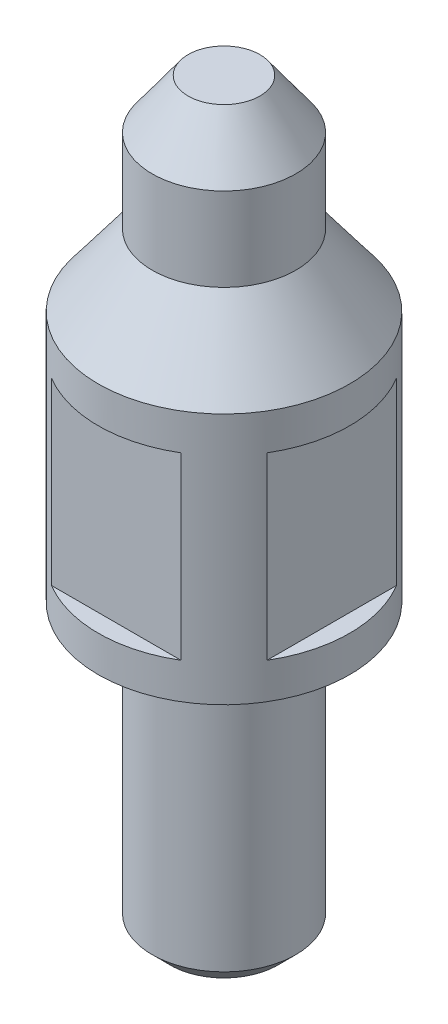
ISO-10303-21;
HEADER;
FILE_DESCRIPTION(('STEP AP214'),'2;1');
FILE_NAME('part.step','',(''),(''),'','','');
FILE_SCHEMA(('AUTOMOTIVE_DESIGN { 1 0 10303 214 1 1 1 1 }'));
ENDSEC;
DATA;
#1=APPLICATION_CONTEXT('core data for automotive mechanical design processes');
#2=APPLICATION_PROTOCOL_DEFINITION('international standard','automotive_design',2000,#1);
#3=PRODUCT_CONTEXT('',#1,'mechanical');
#4=PRODUCT('Part','Part','',(#3));
#5=PRODUCT_RELATED_PRODUCT_CATEGORY('part','',(#4));
#6=PRODUCT_DEFINITION_FORMATION('','',#4);
#7=PRODUCT_DEFINITION_CONTEXT('part definition',#1,'design');
#8=PRODUCT_DEFINITION('design','',#6,#7);
#9=PRODUCT_DEFINITION_SHAPE('','',#8);
#10=(LENGTH_UNIT() NAMED_UNIT(*) SI_UNIT(.MILLI.,.METRE.));
#11=(NAMED_UNIT(*) PLANE_ANGLE_UNIT() SI_UNIT($,.RADIAN.));
#12=(NAMED_UNIT(*) SI_UNIT($,.STERADIAN.) SOLID_ANGLE_UNIT());
#13=UNCERTAINTY_MEASURE_WITH_UNIT(LENGTH_MEASURE(1.E-05),#10,'distance_accuracy_value','');
#14=(GEOMETRIC_REPRESENTATION_CONTEXT(3) GLOBAL_UNCERTAINTY_ASSIGNED_CONTEXT((#13)) GLOBAL_UNIT_ASSIGNED_CONTEXT((#10,
#11,#12)) REPRESENTATION_CONTEXT('',''));
#15=CARTESIAN_POINT('',(0.,0.,0.));
#16=DIRECTION('',(0.,0.,1.));
#17=DIRECTION('',(1.,0.,0.));
#18=AXIS2_PLACEMENT_3D('',#15,#16,#17);
#19=CARTESIAN_POINT('',(0.,-8.,0.));
#20=DIRECTION('',(0.,-1.,0.));
#21=DIRECTION('',(0.,0.,-1.));
#22=AXIS2_PLACEMENT_3D('',#19,#20,#21);
#23=PLANE('',#22);
#24=CARTESIAN_POINT('',(0.,-8.,0.));
#25=DIRECTION('',(0.,-1.,0.));
#26=DIRECTION('',(0.,0.,-1.));
#27=AXIS2_PLACEMENT_3D('',#24,#25,#26);
#28=CIRCLE('',#27,1.5);
#29=CARTESIAN_POINT('',(0.,-8.,-1.5));
#30=VERTEX_POINT('',#29);
#31=EDGE_CURVE('E51',#30,#30,#28,.T.);
#32=ORIENTED_EDGE('',*,*,#31,.T.);
#33=EDGE_LOOP('',(#32));
#34=FACE_BOUND('',#33,.T.);
#35=ADVANCED_FACE('F43',(#34),#23,.T.);
#36=CARTESIAN_POINT('',(0.,-11.0826210676329,0.));
#37=DIRECTION('',(0.,-1.,0.));
#38=DIRECTION('',(0.,0.,-1.));
#39=AXIS2_PLACEMENT_3D('',#36,#37,#38);
#40=CYLINDRICAL_SURFACE('',#39,2.);
#41=CARTESIAN_POINT('',(0.,-7.5,0.));
#42=DIRECTION('',(0.,-1.,0.));
#43=DIRECTION('',(0.,0.,-1.));
#44=AXIS2_PLACEMENT_3D('',#41,#42,#43);
#45=CIRCLE('',#44,2.);
#46=CARTESIAN_POINT('',(0.,-7.5,-2.));
#47=VERTEX_POINT('',#46);
#48=EDGE_CURVE('E11',#47,#47,#45,.F.);
#49=ORIENTED_EDGE('',*,*,#48,.T.);
#50=EDGE_LOOP('',(#49));
#51=FACE_BOUND('',#50,.T.);
#52=CARTESIAN_POINT('',(0.,0.,0.));
#53=DIRECTION('',(0.,-1.,0.));
#54=DIRECTION('',(0.,0.,-1.));
#55=AXIS2_PLACEMENT_3D('',#52,#53,#54);
#56=CIRCLE('',#55,2.);
#57=CARTESIAN_POINT('',(0.,0.,-2.));
#58=VERTEX_POINT('',#57);
#59=EDGE_CURVE('E255',#58,#58,#56,.T.);
#60=ORIENTED_EDGE('',*,*,#59,.T.);
#61=EDGE_LOOP('',(#60));
#62=FACE_BOUND('',#61,.T.);
#63=ADVANCED_FACE('F153',(#51,#62),#40,.T.);
#64=CARTESIAN_POINT('',(2.,0.,0.));
#65=DIRECTION('',(0.,-1.,0.));
#66=DIRECTION('',(0.,0.,-1.));
#67=AXIS2_PLACEMENT_3D('',#64,#65,#66);
#68=PLANE('',#67);
#69=CARTESIAN_POINT('',(0.,0.,0.));
#70=DIRECTION('',(0.,-1.,0.));
#71=DIRECTION('',(0.,0.,-1.));
#72=AXIS2_PLACEMENT_3D('',#69,#70,#71);
#73=CIRCLE('',#72,3.5);
#74=CARTESIAN_POINT('',(0.,0.,-3.5));
#75=VERTEX_POINT('',#74);
#76=EDGE_CURVE('E252',#75,#75,#73,.T.);
#77=ORIENTED_EDGE('',*,*,#76,.T.);
#78=EDGE_LOOP('',(#77));
#79=FACE_BOUND('',#78,.T.);
#80=ORIENTED_EDGE('',*,*,#59,.F.);
#81=EDGE_LOOP('',(#80));
#82=FACE_BOUND('',#81,.T.);
#83=ADVANCED_FACE('F158',(#79,#82),#68,.T.);
#84=CARTESIAN_POINT('',(0.,-11.0826210676329,0.));
#85=DIRECTION('',(0.,-1.,0.));
#86=DIRECTION('',(0.,0.,-1.));
#87=AXIS2_PLACEMENT_3D('',#84,#85,#86);
#88=CYLINDRICAL_SURFACE('',#87,3.5);
#89=CARTESIAN_POINT('',(0.,7.00943276756939,0.));
#90=DIRECTION('',(0.,1.,0.));
#91=DIRECTION('',(0.,0.,1.));
#92=AXIS2_PLACEMENT_3D('',#89,#90,#91);
#93=CIRCLE('',#92,3.5);
#94=CARTESIAN_POINT('',(0.,7.00943276756939,3.5));
#95=VERTEX_POINT('',#94);
#96=EDGE_CURVE('E130',#95,#95,#93,.F.);
#97=ORIENTED_EDGE('',*,*,#96,.T.);
#98=EDGE_LOOP('',(#97));
#99=FACE_BOUND('',#98,.T.);
#100=CARTESIAN_POINT('',(0.,0.999999999999999,0.));
#101=DIRECTION('',(0.,-1.,0.));
#102=DIRECTION('',(0.,0.,-1.));
#103=AXIS2_PLACEMENT_3D('',#100,#101,#102);
#104=CIRCLE('',#103,3.5);
#105=CARTESIAN_POINT('',(-1.802775637732,0.999999999999999,3.));
#106=VERTEX_POINT('',#105);
#107=CARTESIAN_POINT('',(1.80277563773198,0.999999999999999,3.00000000000001));
#108=VERTEX_POINT('',#107);
#109=EDGE_CURVE('E124',#106,#108,#104,.F.);
#110=ORIENTED_EDGE('',*,*,#109,.F.);
#111=DIRECTION('',(0.,-1.,0.));
#112=VECTOR('',#111,1.);
#113=CARTESIAN_POINT('',(-1.802775637732,-11.0826210676329,3.));
#114=LINE('',#113,#112);
#115=CARTESIAN_POINT('',(-1.80277563773201,6.,2.99999999999999));
#116=VERTEX_POINT('',#115);
#117=EDGE_CURVE('E111',#116,#106,#114,.T.);
#118=ORIENTED_EDGE('',*,*,#117,.F.);
#119=CARTESIAN_POINT('',(0.,6.,0.));
#120=DIRECTION('',(0.,1.,0.));
#121=DIRECTION('',(0.,0.,1.));
#122=AXIS2_PLACEMENT_3D('',#119,#120,#121);
#123=CIRCLE('',#122,3.5);
#124=CARTESIAN_POINT('',(1.80277563773198,6.,3.00000000000001));
#125=VERTEX_POINT('',#124);
#126=EDGE_CURVE('E106',#125,#116,#123,.F.);
#127=ORIENTED_EDGE('',*,*,#126,.F.);
#128=DIRECTION('',(0.,-1.,0.));
#129=VECTOR('',#128,1.);
#130=CARTESIAN_POINT('',(1.80277563773198,-11.0826210676329,3.00000000000001));
#131=LINE('',#130,#129);
#132=EDGE_CURVE('E119',#108,#125,#131,.F.);
#133=ORIENTED_EDGE('',*,*,#132,.F.);
#134=EDGE_LOOP('',(#110,#118,#127,#133));
#135=FACE_BOUND('',#134,.T.);
#136=CARTESIAN_POINT('',(0.,6.,0.));
#137=DIRECTION('',(0.,1.,0.));
#138=DIRECTION('',(0.,0.,1.));
#139=AXIS2_PLACEMENT_3D('',#136,#137,#138);
#140=CIRCLE('',#139,3.5);
#141=CARTESIAN_POINT('',(-1.80277563773198,6.,-3.00000000000001));
#142=VERTEX_POINT('',#141);
#143=CARTESIAN_POINT('',(1.802775637732,6.,-2.99999999999999));
#144=VERTEX_POINT('',#143);
#145=EDGE_CURVE('E112',#142,#144,#140,.F.);
#146=ORIENTED_EDGE('',*,*,#145,.F.);
#147=DIRECTION('',(0.,-1.,0.));
#148=VECTOR('',#147,1.);
#149=CARTESIAN_POINT('',(-1.80277563773198,-11.0826210676329,-3.00000000000001));
#150=LINE('',#149,#148);
#151=CARTESIAN_POINT('',(-1.80277563773198,0.999999999999999,-3.00000000000001));
#152=VERTEX_POINT('',#151);
#153=EDGE_CURVE('E282',#152,#142,#150,.F.);
#154=ORIENTED_EDGE('',*,*,#153,.F.);
#155=CARTESIAN_POINT('',(0.,0.999999999999999,0.));
#156=DIRECTION('',(0.,-1.,0.));
#157=DIRECTION('',(0.,0.,-1.));
#158=AXIS2_PLACEMENT_3D('',#155,#156,#157);
#159=CIRCLE('',#158,3.5);
#160=CARTESIAN_POINT('',(1.802775637732,0.999999999999999,-2.99999999999999));
#161=VERTEX_POINT('',#160);
#162=EDGE_CURVE('E278',#161,#152,#159,.F.);
#163=ORIENTED_EDGE('',*,*,#162,.F.);
#164=DIRECTION('',(0.,-1.,0.));
#165=VECTOR('',#164,1.);
#166=CARTESIAN_POINT('',(1.802775637732,-11.0826210676329,-3.));
#167=LINE('',#166,#165);
#168=EDGE_CURVE('E280',#144,#161,#167,.T.);
#169=ORIENTED_EDGE('',*,*,#168,.F.);
#170=EDGE_LOOP('',(#146,#154,#163,#169));
#171=FACE_BOUND('',#170,.T.);
#172=CARTESIAN_POINT('',(0.,0.999999999999999,0.));
#173=DIRECTION('',(0.,-1.,0.));
#174=DIRECTION('',(0.,0.,-1.));
#175=AXIS2_PLACEMENT_3D('',#172,#173,#174);
#176=CIRCLE('',#175,3.5);
#177=CARTESIAN_POINT('',(3.,0.999999999999999,1.80277563773199));
#178=VERTEX_POINT('',#177);
#179=CARTESIAN_POINT('',(3.,0.999999999999999,-1.80277563773199));
#180=VERTEX_POINT('',#179);
#181=EDGE_CURVE('E276',#178,#180,#176,.F.);
#182=ORIENTED_EDGE('',*,*,#181,.F.);
#183=DIRECTION('',(0.,-1.,0.));
#184=VECTOR('',#183,1.);
#185=CARTESIAN_POINT('',(3.,-11.0826210676329,1.80277563773199));
#186=LINE('',#185,#184);
#187=CARTESIAN_POINT('',(3.,6.,1.80277563773199));
#188=VERTEX_POINT('',#187);
#189=EDGE_CURVE('E270',#188,#178,#186,.T.);
#190=ORIENTED_EDGE('',*,*,#189,.F.);
#191=CARTESIAN_POINT('',(0.,6.,0.));
#192=DIRECTION('',(0.,1.,0.));
#193=DIRECTION('',(0.,0.,1.));
#194=AXIS2_PLACEMENT_3D('',#191,#192,#193);
#195=CIRCLE('',#194,3.5);
#196=CARTESIAN_POINT('',(3.,6.,-1.80277563773199));
#197=VERTEX_POINT('',#196);
#198=EDGE_CURVE('E268',#197,#188,#195,.F.);
#199=ORIENTED_EDGE('',*,*,#198,.F.);
#200=DIRECTION('',(0.,-1.,0.));
#201=VECTOR('',#200,1.);
#202=CARTESIAN_POINT('',(3.,-11.0826210676329,-1.80277563773199));
#203=LINE('',#202,#201);
#204=EDGE_CURVE('E273',#180,#197,#203,.F.);
#205=ORIENTED_EDGE('',*,*,#204,.F.);
#206=EDGE_LOOP('',(#182,#190,#199,#205));
#207=FACE_BOUND('',#206,.T.);
#208=CARTESIAN_POINT('',(0.,6.,0.));
#209=DIRECTION('',(0.,1.,0.));
#210=DIRECTION('',(0.,0.,1.));
#211=AXIS2_PLACEMENT_3D('',#208,#209,#210);
#212=CIRCLE('',#211,3.5);
#213=CARTESIAN_POINT('',(-3.,6.,1.80277563773199));
#214=VERTEX_POINT('',#213);
#215=CARTESIAN_POINT('',(-3.,6.,-1.80277563773199));
#216=VERTEX_POINT('',#215);
#217=EDGE_CURVE('E266',#214,#216,#212,.F.);
#218=ORIENTED_EDGE('',*,*,#217,.F.);
#219=DIRECTION('',(0.,-1.,0.));
#220=VECTOR('',#219,1.);
#221=CARTESIAN_POINT('',(-3.,-11.0826210676329,1.80277563773199));
#222=LINE('',#221,#220);
#223=CARTESIAN_POINT('',(-3.,0.999999999999999,1.80277563773199));
#224=VERTEX_POINT('',#223);
#225=EDGE_CURVE('E263',#224,#214,#222,.F.);
#226=ORIENTED_EDGE('',*,*,#225,.F.);
#227=CARTESIAN_POINT('',(0.,0.999999999999999,0.));
#228=DIRECTION('',(0.,-1.,0.));
#229=DIRECTION('',(0.,0.,-1.));
#230=AXIS2_PLACEMENT_3D('',#227,#228,#229);
#231=CIRCLE('',#230,3.5);
#232=CARTESIAN_POINT('',(-3.,0.999999999999999,-1.80277563773199));
#233=VERTEX_POINT('',#232);
#234=EDGE_CURVE('E258',#233,#224,#231,.F.);
#235=ORIENTED_EDGE('',*,*,#234,.F.);
#236=DIRECTION('',(0.,-1.,0.));
#237=VECTOR('',#236,1.);
#238=CARTESIAN_POINT('',(-3.,-11.0826210676329,-1.80277563773199));
#239=LINE('',#238,#237);
#240=EDGE_CURVE('E260',#216,#233,#239,.T.);
#241=ORIENTED_EDGE('',*,*,#240,.F.);
#242=EDGE_LOOP('',(#218,#226,#235,#241));
#243=FACE_BOUND('',#242,.T.);
#244=ORIENTED_EDGE('',*,*,#76,.F.);
#245=EDGE_LOOP('',(#244));
#246=FACE_BOUND('',#245,.T.);
#247=ADVANCED_FACE('F122',(#99,#135,#171,#207,#243,#246),#88,.T.);
#248=CARTESIAN_POINT('',(0.,-11.0826210676329,0.));
#249=DIRECTION('',(0.,-1.,0.));
#250=DIRECTION('',(0.,0.,-1.));
#251=AXIS2_PLACEMENT_3D('',#248,#249,#250);
#252=CYLINDRICAL_SURFACE('',#251,2.);
#253=CARTESIAN_POINT('',(0.,11.3236180795288,0.));
#254=DIRECTION('',(0.,1.,0.));
#255=DIRECTION('',(0.,0.,1.));
#256=AXIS2_PLACEMENT_3D('',#253,#254,#255);
#257=CIRCLE('',#256,2.);
#258=CARTESIAN_POINT('',(0.,11.3236180795288,-2.));
#259=VERTEX_POINT('',#258);
#260=EDGE_CURVE('E133',#259,#259,#257,.F.);
#261=ORIENTED_EDGE('',*,*,#260,.T.);
#262=EDGE_LOOP('',(#261));
#263=FACE_BOUND('',#262,.T.);
#264=CARTESIAN_POINT('',(0.,9.,0.));
#265=DIRECTION('',(0.,-1.,0.));
#266=DIRECTION('',(0.,0.,-1.));
#267=AXIS2_PLACEMENT_3D('',#264,#265,#266);
#268=CIRCLE('',#267,2.);
#269=CARTESIAN_POINT('',(0.,9.,-2.));
#270=VERTEX_POINT('',#269);
#271=EDGE_CURVE('E174',#270,#270,#268,.T.);
#272=ORIENTED_EDGE('',*,*,#271,.F.);
#273=EDGE_LOOP('',(#272));
#274=FACE_BOUND('',#273,.T.);
#275=ADVANCED_FACE('F177',(#263,#274),#252,.T.);
#276=CARTESIAN_POINT('',(2.,12.7,0.));
#277=DIRECTION('',(0.,1.,0.));
#278=DIRECTION('',(0.,0.,1.));
#279=AXIS2_PLACEMENT_3D('',#276,#277,#278);
#280=PLANE('',#279);
#281=CARTESIAN_POINT('',(0.,12.7,0.));
#282=DIRECTION('',(0.,1.,0.));
#283=DIRECTION('',(0.,0.,1.));
#284=AXIS2_PLACEMENT_3D('',#281,#282,#283);
#285=CIRCLE('',#284,1.);
#286=CARTESIAN_POINT('',(0.,12.7,-1.));
#287=VERTEX_POINT('',#286);
#288=EDGE_CURVE('E136',#287,#287,#285,.T.);
#289=ORIENTED_EDGE('',*,*,#288,.T.);
#290=EDGE_LOOP('',(#289));
#291=FACE_BOUND('',#290,.T.);
#292=ADVANCED_FACE('F182',(#291),#280,.T.);
#293=CARTESIAN_POINT('',(-3.5,6.,-3.5));
#294=DIRECTION('',(0.,1.,0.));
#295=DIRECTION('',(0.,0.,1.));
#296=AXIS2_PLACEMENT_3D('',#293,#294,#295);
#297=PLANE('',#296);
#298=DIRECTION('',(0.,0.,1.));
#299=VECTOR('',#298,1.);
#300=CARTESIAN_POINT('',(-3.,6.,-3.5));
#301=LINE('',#300,#299);
#302=EDGE_CURVE('E246',#216,#214,#301,.T.);
#303=ORIENTED_EDGE('',*,*,#302,.T.);
#304=ORIENTED_EDGE('',*,*,#217,.T.);
#305=EDGE_LOOP('',(#303,#304));
#306=FACE_BOUND('',#305,.T.);
#307=ADVANCED_FACE('F190',(#306),#297,.F.);
#308=CARTESIAN_POINT('',(-3.,6.,-3.5));
#309=DIRECTION('',(1.,0.,0.));
#310=DIRECTION('',(0.,1.,0.));
#311=AXIS2_PLACEMENT_3D('',#308,#309,#310);
#312=PLANE('',#311);
#313=ORIENTED_EDGE('',*,*,#225,.T.);
#314=ORIENTED_EDGE('',*,*,#302,.F.);
#315=ORIENTED_EDGE('',*,*,#240,.T.);
#316=DIRECTION('',(0.,0.,1.));
#317=VECTOR('',#316,1.);
#318=CARTESIAN_POINT('',(-3.,0.999999999999999,-3.5));
#319=LINE('',#318,#317);
#320=EDGE_CURVE('E243',#233,#224,#319,.T.);
#321=ORIENTED_EDGE('',*,*,#320,.T.);
#322=EDGE_LOOP('',(#313,#314,#315,#321));
#323=FACE_BOUND('',#322,.T.);
#324=ADVANCED_FACE('F196',(#323),#312,.F.);
#325=CARTESIAN_POINT('',(-3.5,0.999999999999999,-3.5));
#326=DIRECTION('',(0.,-1.,0.));
#327=DIRECTION('',(0.,0.,-1.));
#328=AXIS2_PLACEMENT_3D('',#325,#326,#327);
#329=PLANE('',#328);
#330=ORIENTED_EDGE('',*,*,#320,.F.);
#331=ORIENTED_EDGE('',*,*,#234,.T.);
#332=EDGE_LOOP('',(#330,#331));
#333=FACE_BOUND('',#332,.T.);
#334=ADVANCED_FACE('F192',(#333),#329,.F.);
#335=CARTESIAN_POINT('',(3.5,0.999999999999999,-3.5));
#336=DIRECTION('',(0.,-1.,0.));
#337=DIRECTION('',(0.,0.,-1.));
#338=AXIS2_PLACEMENT_3D('',#335,#336,#337);
#339=PLANE('',#338);
#340=DIRECTION('',(0.,0.,1.));
#341=VECTOR('',#340,1.);
#342=CARTESIAN_POINT('',(3.,0.999999999999999,-3.5));
#343=LINE('',#342,#341);
#344=EDGE_CURVE('E240',#180,#178,#343,.T.);
#345=ORIENTED_EDGE('',*,*,#344,.T.);
#346=ORIENTED_EDGE('',*,*,#181,.T.);
#347=EDGE_LOOP('',(#345,#346));
#348=FACE_BOUND('',#347,.T.);
#349=ADVANCED_FACE('F195',(#348),#339,.F.);
#350=CARTESIAN_POINT('',(3.,6.,-3.5));
#351=DIRECTION('',(-1.,0.,0.));
#352=DIRECTION('',(0.,-1.,0.));
#353=AXIS2_PLACEMENT_3D('',#350,#351,#352);
#354=PLANE('',#353);
#355=ORIENTED_EDGE('',*,*,#204,.T.);
#356=DIRECTION('',(0.,0.,1.));
#357=VECTOR('',#356,1.);
#358=CARTESIAN_POINT('',(3.,6.,-3.5));
#359=LINE('',#358,#357);
#360=EDGE_CURVE('E238',#197,#188,#359,.T.);
#361=ORIENTED_EDGE('',*,*,#360,.T.);
#362=ORIENTED_EDGE('',*,*,#189,.T.);
#363=ORIENTED_EDGE('',*,*,#344,.F.);
#364=EDGE_LOOP('',(#355,#361,#362,#363));
#365=FACE_BOUND('',#364,.T.);
#366=ADVANCED_FACE('F208',(#365),#354,.F.);
#367=CARTESIAN_POINT('',(3.5,6.,-3.5));
#368=DIRECTION('',(0.,1.,0.));
#369=DIRECTION('',(0.,0.,1.));
#370=AXIS2_PLACEMENT_3D('',#367,#368,#369);
#371=PLANE('',#370);
#372=ORIENTED_EDGE('',*,*,#360,.F.);
#373=ORIENTED_EDGE('',*,*,#198,.T.);
#374=EDGE_LOOP('',(#372,#373));
#375=FACE_BOUND('',#374,.T.);
#376=ADVANCED_FACE('F204',(#375),#371,.F.);
#377=CARTESIAN_POINT('',(3.50000000000002,6.,-3.49999999999999));
#378=DIRECTION('',(0.,1.,0.));
#379=DIRECTION('',(0.,0.,1.));
#380=AXIS2_PLACEMENT_3D('',#377,#378,#379);
#381=PLANE('',#380);
#382=DIRECTION('',(-1.,0.,0.));
#383=VECTOR('',#382,1.);
#384=CARTESIAN_POINT('',(3.50000000000002,6.,-2.99999999999999));
#385=LINE('',#384,#383);
#386=EDGE_CURVE('E234',#144,#142,#385,.T.);
#387=ORIENTED_EDGE('',*,*,#386,.T.);
#388=ORIENTED_EDGE('',*,*,#145,.T.);
#389=EDGE_LOOP('',(#387,#388));
#390=FACE_BOUND('',#389,.T.);
#391=ADVANCED_FACE('F207',(#390),#381,.F.);
#392=CARTESIAN_POINT('',(3.50000000000002,6.,-2.99999999999999));
#393=DIRECTION('',(0.,0.,1.));
#394=DIRECTION('',(1.,0.,0.));
#395=AXIS2_PLACEMENT_3D('',#392,#393,#394);
#396=PLANE('',#395);
#397=ORIENTED_EDGE('',*,*,#153,.T.);
#398=ORIENTED_EDGE('',*,*,#386,.F.);
#399=ORIENTED_EDGE('',*,*,#168,.T.);
#400=DIRECTION('',(-1.,0.,0.));
#401=VECTOR('',#400,1.);
#402=CARTESIAN_POINT('',(3.50000000000002,0.999999999999999,-2.99999999999999));
#403=LINE('',#402,#401);
#404=EDGE_CURVE('E64',#161,#152,#403,.T.);
#405=ORIENTED_EDGE('',*,*,#404,.T.);
#406=EDGE_LOOP('',(#397,#398,#399,#405));
#407=FACE_BOUND('',#406,.T.);
#408=ADVANCED_FACE('F220',(#407),#396,.F.);
#409=CARTESIAN_POINT('',(3.50000000000002,0.999999999999999,-3.49999999999999));
#410=DIRECTION('',(0.,-1.,0.));
#411=DIRECTION('',(0.,0.,-1.));
#412=AXIS2_PLACEMENT_3D('',#409,#410,#411);
#413=PLANE('',#412);
#414=ORIENTED_EDGE('',*,*,#162,.T.);
#415=ORIENTED_EDGE('',*,*,#404,.F.);
#416=EDGE_LOOP('',(#414,#415));
#417=FACE_BOUND('',#416,.T.);
#418=ADVANCED_FACE('F216',(#417),#413,.F.);
#419=CARTESIAN_POINT('',(3.5,0.999999999999999,3.50000000000001));
#420=DIRECTION('',(0.,-1.,0.));
#421=DIRECTION('',(0.,0.,-1.));
#422=AXIS2_PLACEMENT_3D('',#419,#420,#421);
#423=PLANE('',#422);
#424=DIRECTION('',(-1.,0.,0.));
#425=VECTOR('',#424,1.);
#426=CARTESIAN_POINT('',(3.5,0.999999999999999,3.00000000000001));
#427=LINE('',#426,#425);
#428=EDGE_CURVE('E120',#108,#106,#427,.T.);
#429=ORIENTED_EDGE('',*,*,#428,.T.);
#430=ORIENTED_EDGE('',*,*,#109,.T.);
#431=EDGE_LOOP('',(#429,#430));
#432=FACE_BOUND('',#431,.T.);
#433=ADVANCED_FACE('F219',(#432),#423,.F.);
#434=CARTESIAN_POINT('',(3.5,6.,3.00000000000001));
#435=DIRECTION('',(0.,0.,-1.));
#436=DIRECTION('',(-1.,0.,0.));
#437=AXIS2_PLACEMENT_3D('',#434,#435,#436);
#438=PLANE('',#437);
#439=ORIENTED_EDGE('',*,*,#132,.T.);
#440=DIRECTION('',(-1.,0.,0.));
#441=VECTOR('',#440,1.);
#442=CARTESIAN_POINT('',(3.5,6.,3.00000000000001));
#443=LINE('',#442,#441);
#444=EDGE_CURVE('E57',#125,#116,#443,.T.);
#445=ORIENTED_EDGE('',*,*,#444,.T.);
#446=ORIENTED_EDGE('',*,*,#117,.T.);
#447=ORIENTED_EDGE('',*,*,#428,.F.);
#448=EDGE_LOOP('',(#439,#445,#446,#447));
#449=FACE_BOUND('',#448,.T.);
#450=ADVANCED_FACE('F116',(#449),#438,.F.);
#451=CARTESIAN_POINT('',(3.5,6.,3.50000000000001));
#452=DIRECTION('',(0.,1.,0.));
#453=DIRECTION('',(0.,0.,1.));
#454=AXIS2_PLACEMENT_3D('',#451,#452,#453);
#455=PLANE('',#454);
#456=ORIENTED_EDGE('',*,*,#126,.T.);
#457=ORIENTED_EDGE('',*,*,#444,.F.);
#458=EDGE_LOOP('',(#456,#457));
#459=FACE_BOUND('',#458,.T.);
#460=ADVANCED_FACE('F107',(#459),#455,.F.);
#461=CARTESIAN_POINT('',(0.,7.00943276756939,0.));
#462=DIRECTION('',(0.,-1.,0.));
#463=DIRECTION('',(0.,0.,-1.));
#464=AXIS2_PLACEMENT_3D('',#461,#462,#463);
#465=CONICAL_SURFACE('',#464,3.5,0.645771823237904);
#466=ORIENTED_EDGE('',*,*,#271,.T.);
#467=EDGE_LOOP('',(#466));
#468=FACE_BOUND('',#467,.T.);
#469=ORIENTED_EDGE('',*,*,#96,.F.);
#470=EDGE_LOOP('',(#469));
#471=FACE_BOUND('',#470,.T.);
#472=ADVANCED_FACE('F149',(#468,#471),#465,.T.);
#473=CARTESIAN_POINT('',(0.,11.3236180795288,0.));
#474=DIRECTION('',(0.,-1.,0.));
#475=DIRECTION('',(0.,0.,-1.));
#476=AXIS2_PLACEMENT_3D('',#473,#474,#475);
#477=CONICAL_SURFACE('',#476,2.,0.62831853071796);
#478=CARTESIAN_POINT('',(0.,12.7,-1.));
#479=CARTESIAN_POINT('',(0.,12.6856626883284,-1.01041666666667));
#480=CARTESIAN_POINT('',(0.,12.6713253766568,-1.02083333333333));
#481=CARTESIAN_POINT('',(0.,12.6426507533137,-1.04166666666667));
#482=CARTESIAN_POINT('',(0.,12.6283134416421,-1.05208333333333));
#483=CARTESIAN_POINT('',(0.,12.599638818299,-1.07291666666667));
#484=CARTESIAN_POINT('',(0.,12.5853015066274,-1.08333333333333));
#485=CARTESIAN_POINT('',(0.,12.5566268832843,-1.10416666666667));
#486=CARTESIAN_POINT('',(0.,12.5422895716127,-1.11458333333333));
#487=CARTESIAN_POINT('',(0.,12.5136149482695,-1.13541666666667));
#488=CARTESIAN_POINT('',(0.,12.499277636598,-1.14583333333333));
#489=CARTESIAN_POINT('',(0.,12.4706030132548,-1.16666666666667));
#490=CARTESIAN_POINT('',(0.,12.4562657015832,-1.17708333333333));
#491=CARTESIAN_POINT('',(0.,12.4275910782401,-1.19791666666667));
#492=CARTESIAN_POINT('',(0.,12.4132537665685,-1.20833333333333));
#493=CARTESIAN_POINT('',(0.,12.3845791432254,-1.22916666666667));
#494=CARTESIAN_POINT('',(0.,12.3702418315538,-1.23958333333333));
#495=CARTESIAN_POINT('',(0.,12.3415672082106,-1.26041666666667));
#496=CARTESIAN_POINT('',(0.,12.3272298965391,-1.27083333333333));
#497=CARTESIAN_POINT('',(0.,12.2985552731959,-1.29166666666667));
#498=CARTESIAN_POINT('',(0.,12.2842179615243,-1.30208333333333));
#499=CARTESIAN_POINT('',(0.,12.2555433381812,-1.32291666666667));
#500=CARTESIAN_POINT('',(0.,12.2412060265096,-1.33333333333333));
#501=CARTESIAN_POINT('',(0.,12.2125314031665,-1.35416666666667));
#502=CARTESIAN_POINT('',(0.,12.1981940914949,-1.36458333333333));
#503=CARTESIAN_POINT('',(0.,12.1695194681517,-1.38541666666667));
#504=CARTESIAN_POINT('',(0.,12.1551821564802,-1.39583333333333));
#505=CARTESIAN_POINT('',(0.,12.126507533137,-1.41666666666667));
#506=CARTESIAN_POINT('',(0.,12.1121702214654,-1.42708333333333));
#507=CARTESIAN_POINT('',(0.,12.0834955981223,-1.44791666666667));
#508=CARTESIAN_POINT('',(0.,12.0691582864507,-1.45833333333333));
#509=CARTESIAN_POINT('',(0.,12.0404836631076,-1.47916666666667));
#510=CARTESIAN_POINT('',(0.,12.026146351436,-1.48958333333333));
#511=CARTESIAN_POINT('',(0.,11.9974717280928,-1.51041666666667));
#512=CARTESIAN_POINT('',(0.,11.9831344164213,-1.52083333333333));
#513=CARTESIAN_POINT('',(0.,11.9544597930781,-1.54166666666667));
#514=CARTESIAN_POINT('',(0.,11.9401224814065,-1.55208333333333));
#515=CARTESIAN_POINT('',(0.,11.9114478580634,-1.57291666666667));
#516=CARTESIAN_POINT('',(0.,11.8971105463918,-1.58333333333333));
#517=CARTESIAN_POINT('',(0.,11.8684359230487,-1.60416666666667));
#518=CARTESIAN_POINT('',(0.,11.8540986113771,-1.61458333333333));
#519=CARTESIAN_POINT('',(0.,11.8254239880339,-1.63541666666667));
#520=CARTESIAN_POINT('',(0.,11.8110866763624,-1.64583333333333));
#521=CARTESIAN_POINT('',(0.,11.7824120530192,-1.66666666666667));
#522=CARTESIAN_POINT('',(0.,11.7680747413476,-1.67708333333333));
#523=CARTESIAN_POINT('',(0.,11.7394001180045,-1.69791666666667));
#524=CARTESIAN_POINT('',(0.,11.7250628063329,-1.70833333333333));
#525=CARTESIAN_POINT('',(0.,11.6963881829898,-1.72916666666667));
#526=CARTESIAN_POINT('',(0.,11.6820508713182,-1.73958333333333));
#527=CARTESIAN_POINT('',(0.,11.653376247975,-1.76041666666667));
#528=CARTESIAN_POINT('',(0.,11.6390389363035,-1.77083333333333));
#529=CARTESIAN_POINT('',(0.,11.6103643129603,-1.79166666666667));
#530=CARTESIAN_POINT('',(0.,11.5960270012887,-1.80208333333333));
#531=CARTESIAN_POINT('',(0.,11.5673523779456,-1.82291666666667));
#532=CARTESIAN_POINT('',(0.,11.553015066274,-1.83333333333333));
#533=CARTESIAN_POINT('',(0.,11.5243404429309,-1.85416666666667));
#534=CARTESIAN_POINT('',(0.,11.5100031312593,-1.86458333333333));
#535=CARTESIAN_POINT('',(0.,11.4813285079161,-1.88541666666667));
#536=CARTESIAN_POINT('',(0.,11.4669911962446,-1.89583333333333));
#537=CARTESIAN_POINT('',(0.,11.4383165729014,-1.91666666666667));
#538=CARTESIAN_POINT('',(0.,11.4239792612299,-1.92708333333333));
#539=CARTESIAN_POINT('',(0.,11.3953046378867,-1.94791666666667));
#540=CARTESIAN_POINT('',(0.,11.3809673262151,-1.95833333333333));
#541=CARTESIAN_POINT('',(0.,11.352292702872,-1.97916666666667));
#542=CARTESIAN_POINT('',(0.,11.3379553912004,-1.98958333333333));
#543=CARTESIAN_POINT('',(0.,11.3236180795288,-2.));
#544=B_SPLINE_CURVE_WITH_KNOTS('',3,(#478,#479,#480,#481,#482,#483,#484,#485,#486,#487,#488,
#489,#490,#491,#492,#493,#494,#495,#496,#497,#498,#499,#500,#501,#502,#503,#504,#505,#506,#507,
#508,#509,#510,#511,#512,#513,#514,#515,#516,#517,#518,#519,#520,#521,#522,#523,#524,#525,#526,
#527,#528,#529,#530,#531,#532,#533,#534,#535,#536,#537,#538,#539,#540,#541,#542,#543),
.UNSPECIFIED.,.F.,.F.,(4,2,2,2,2,2,2,2,2,2,2,2,2,2,2,2,2,2,2,2,2,2,2,2,2,2,2,2,2,2,2,2,4),(0.,
0.0531656755220012,0.106331351044004,0.159497026566007,0.212662702088009,0.265828377610012,
0.318994053132015,0.372159728654016,0.425325404176019,0.478491079698021,0.531656755220024,
0.584822430742026,0.637988106264028,0.691153781786031,0.744319457308034,0.797485132830036,
0.850650808352039,0.90381648387404,0.956982159396043,1.01014783491805,1.06331351044005,
1.11647918596205,1.16964486148405,1.22281053700606,1.27597621252806,1.32914188805006,
1.38230756357206,1.43547323909407,1.48863891461607,1.54180459013807,1.59497026566007,
1.64813594118208,1.70130161670408),.UNSPECIFIED.);
#545=EDGE_CURVE('BSEAM143',#287,#259,#544,.T.);
#546=ORIENTED_EDGE('',*,*,#288,.F.);
#547=ORIENTED_EDGE('',*,*,#260,.F.);
#548=ORIENTED_EDGE('',*,*,#545,.T.);
#549=ORIENTED_EDGE('',*,*,#545,.F.);
#550=EDGE_LOOP('',(#546,#548,#547,#549));
#551=FACE_BOUND('',#550,.T.);
#552=ADVANCED_FACE('F143',(#551),#477,.T.);
#553=CARTESIAN_POINT('',(0.,-8.,0.));
#554=DIRECTION('',(0.,1.,0.));
#555=DIRECTION('',(0.,0.,1.));
#556=AXIS2_PLACEMENT_3D('',#553,#554,#555);
#557=CONICAL_SURFACE('',#556,1.5,0.785398163397448);
#558=ORIENTED_EDGE('',*,*,#48,.F.);
#559=EDGE_LOOP('',(#558));
#560=FACE_BOUND('',#559,.T.);
#561=ORIENTED_EDGE('',*,*,#31,.F.);
#562=EDGE_LOOP('',(#561));
#563=FACE_BOUND('',#562,.T.);
#564=ADVANCED_FACE('F45',(#560,#563),#557,.T.);
#565=CLOSED_SHELL('',(#35,#63,#83,#247,#275,#292,#307,#324,#334,#349,#366,#376,#391,#408,#418,
#433,#450,#460,#472,#552,#564));
#566=MANIFOLD_SOLID_BREP('B2',#565);
#567=ADVANCED_BREP_SHAPE_REPRESENTATION('',(#18,#566),#14);
#568=SHAPE_DEFINITION_REPRESENTATION(#9,#567);
ENDSEC;
END-ISO-10303-21;
